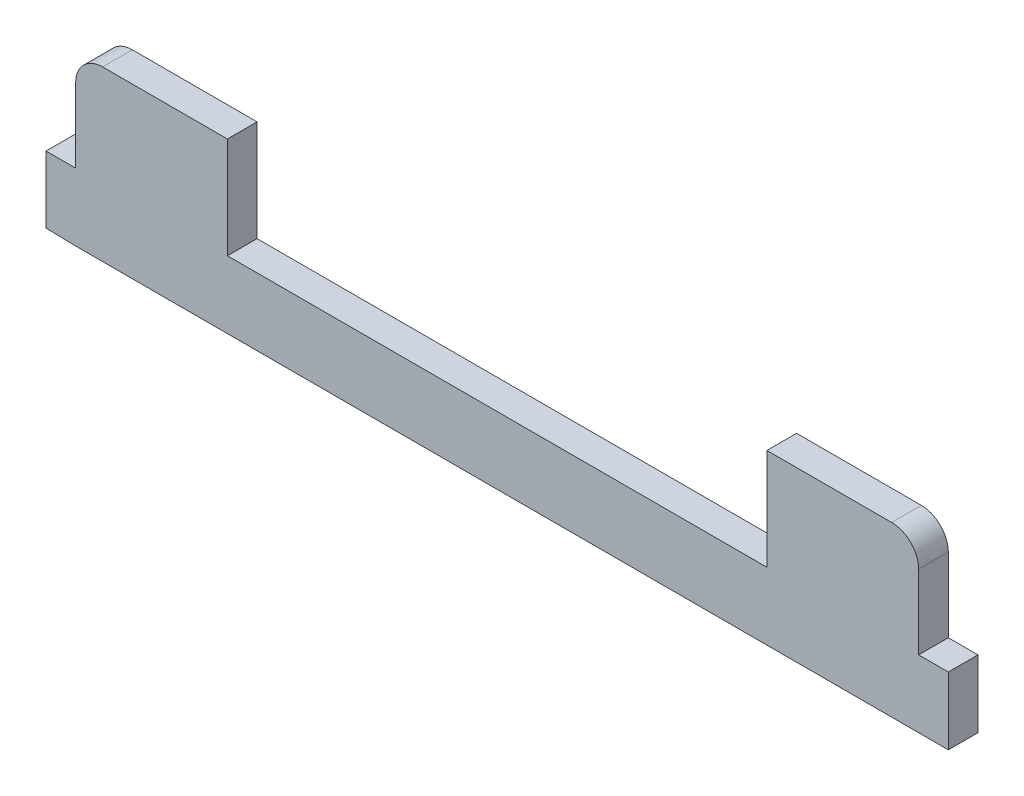
ISO-10303-21;
HEADER;
FILE_DESCRIPTION(('STEP AP214'),'2;1');
FILE_NAME('part.step','',(''),(''),'','','');
FILE_SCHEMA(('AUTOMOTIVE_DESIGN { 1 0 10303 214 1 1 1 1 }'));
ENDSEC;
DATA;
#1=APPLICATION_CONTEXT('core data for automotive mechanical design processes');
#2=APPLICATION_PROTOCOL_DEFINITION('international standard','automotive_design',2000,#1);
#3=PRODUCT_CONTEXT('',#1,'mechanical');
#4=PRODUCT('Part','Part','',(#3));
#5=PRODUCT_RELATED_PRODUCT_CATEGORY('part','',(#4));
#6=PRODUCT_DEFINITION_FORMATION('','',#4);
#7=PRODUCT_DEFINITION_CONTEXT('part definition',#1,'design');
#8=PRODUCT_DEFINITION('design','',#6,#7);
#9=PRODUCT_DEFINITION_SHAPE('','',#8);
#10=(LENGTH_UNIT() NAMED_UNIT(*) SI_UNIT(.MILLI.,.METRE.));
#11=(NAMED_UNIT(*) PLANE_ANGLE_UNIT() SI_UNIT($,.RADIAN.));
#12=(NAMED_UNIT(*) SI_UNIT($,.STERADIAN.) SOLID_ANGLE_UNIT());
#13=UNCERTAINTY_MEASURE_WITH_UNIT(LENGTH_MEASURE(1.E-05),#10,'distance_accuracy_value','');
#14=(GEOMETRIC_REPRESENTATION_CONTEXT(3) GLOBAL_UNCERTAINTY_ASSIGNED_CONTEXT((#13)) GLOBAL_UNIT_ASSIGNED_CONTEXT((#10,
#11,#12)) REPRESENTATION_CONTEXT('',''));
#15=CARTESIAN_POINT('',(0.,0.,0.));
#16=DIRECTION('',(0.,0.,1.));
#17=DIRECTION('',(1.,0.,0.));
#18=AXIS2_PLACEMENT_3D('',#15,#16,#17);
#19=CARTESIAN_POINT('',(-6.99571141739677,0.0621124365959985,2.794));
#20=DIRECTION('',(0.0222251589990039,0.999752990646924,0.));
#21=DIRECTION('',(-0.999752990646924,0.0222251589990039,0.));
#22=AXIS2_PLACEMENT_3D('',#19,#20,#21);
#23=PLANE('',#22);
#24=DIRECTION('',(0.999752990646924,-0.0222251589990039,0.));
#25=VECTOR('',#24,1.);
#26=CARTESIAN_POINT('',(-6.99571141739677,0.0621124365959985,0.));
#27=LINE('',#26,#25);
#28=CARTESIAN_POINT('',(-6.99571141739677,0.0621124365959985,0.));
#29=VERTEX_POINT('',#28);
#30=CARTESIAN_POINT('',(-4.20171141739677,0.,0.));
#31=VERTEX_POINT('',#30);
#32=EDGE_CURVE('E162',#29,#31,#27,.T.);
#33=ORIENTED_EDGE('',*,*,#32,.T.);
#34=DIRECTION('',(0.,0.,-1.));
#35=VECTOR('',#34,1.);
#36=CARTESIAN_POINT('',(-4.20171141739677,0.,2.794));
#37=LINE('',#36,#35);
#38=CARTESIAN_POINT('',(-4.20171141739677,0.,2.794));
#39=VERTEX_POINT('',#38);
#40=EDGE_CURVE('E143',#39,#31,#37,.T.);
#41=ORIENTED_EDGE('',*,*,#40,.F.);
#42=DIRECTION('',(0.999752990646924,-0.0222251589990039,0.));
#43=VECTOR('',#42,1.);
#44=CARTESIAN_POINT('',(-6.99571141739677,0.0621124365959985,2.794));
#45=LINE('',#44,#43);
#46=CARTESIAN_POINT('',(-6.99571141739677,0.0621124365959985,2.794));
#47=VERTEX_POINT('',#46);
#48=EDGE_CURVE('E149',#47,#39,#45,.T.);
#49=ORIENTED_EDGE('',*,*,#48,.F.);
#50=DIRECTION('',(0.,0.,-1.));
#51=VECTOR('',#50,1.);
#52=CARTESIAN_POINT('',(-6.99571141739677,0.0621124365959985,2.794));
#53=LINE('',#52,#51);
#54=EDGE_CURVE('E215',#47,#29,#53,.T.);
#55=ORIENTED_EDGE('',*,*,#54,.T.);
#56=EDGE_LOOP('',(#33,#41,#49,#55));
#57=FACE_BOUND('',#56,.T.);
#58=ADVANCED_FACE('F32',(#57),#23,.F.);
#59=CARTESIAN_POINT('',(77.9672885826032,0.,2.794));
#60=DIRECTION('',(0.,1.,0.));
#61=DIRECTION('',(-1.,0.,0.));
#62=AXIS2_PLACEMENT_3D('',#59,#60,#61);
#63=PLANE('',#62);
#64=DIRECTION('',(1.,0.,0.));
#65=VECTOR('',#64,1.);
#66=CARTESIAN_POINT('',(77.9672885826032,0.,0.));
#67=LINE('',#66,#65);
#68=CARTESIAN_POINT('',(77.9672885826032,0.,0.));
#69=VERTEX_POINT('',#68);
#70=EDGE_CURVE('E247',#31,#69,#67,.T.);
#71=ORIENTED_EDGE('',*,*,#70,.T.);
#72=DIRECTION('',(0.,0.,-1.));
#73=VECTOR('',#72,1.);
#74=CARTESIAN_POINT('',(77.9672885826032,0.,2.794));
#75=LINE('',#74,#73);
#76=CARTESIAN_POINT('',(77.9672885826032,0.,2.794));
#77=VERTEX_POINT('',#76);
#78=EDGE_CURVE('E146',#77,#69,#75,.T.);
#79=ORIENTED_EDGE('',*,*,#78,.F.);
#80=DIRECTION('',(1.,0.,0.));
#81=VECTOR('',#80,1.);
#82=CARTESIAN_POINT('',(-4.20171141739677,0.,2.794));
#83=LINE('',#82,#81);
#84=EDGE_CURVE('E139',#39,#77,#83,.T.);
#85=ORIENTED_EDGE('',*,*,#84,.F.);
#86=ORIENTED_EDGE('',*,*,#40,.T.);
#87=EDGE_LOOP('',(#71,#79,#85,#86));
#88=FACE_BOUND('',#87,.T.);
#89=ADVANCED_FACE('F141',(#88),#63,.F.);
#90=CARTESIAN_POINT('',(77.9672885826032,6.35,2.794));
#91=DIRECTION('',(-1.,0.,0.));
#92=DIRECTION('',(0.,0.,1.));
#93=AXIS2_PLACEMENT_3D('',#90,#91,#92);
#94=PLANE('',#93);
#95=DIRECTION('',(0.,1.,0.));
#96=VECTOR('',#95,1.);
#97=CARTESIAN_POINT('',(77.9672885826032,6.35,0.));
#98=LINE('',#97,#96);
#99=CARTESIAN_POINT('',(77.9672885826032,6.35,0.));
#100=VERTEX_POINT('',#99);
#101=EDGE_CURVE('E246',#69,#100,#98,.T.);
#102=ORIENTED_EDGE('',*,*,#101,.T.);
#103=DIRECTION('',(0.,0.,-1.));
#104=VECTOR('',#103,1.);
#105=CARTESIAN_POINT('',(77.9672885826032,6.35,2.794));
#106=LINE('',#105,#104);
#107=CARTESIAN_POINT('',(77.9672885826032,6.35,2.794));
#108=VERTEX_POINT('',#107);
#109=EDGE_CURVE('E168',#108,#100,#106,.T.);
#110=ORIENTED_EDGE('',*,*,#109,.F.);
#111=DIRECTION('',(0.,1.,0.));
#112=VECTOR('',#111,1.);
#113=CARTESIAN_POINT('',(77.9672885826032,6.35,2.794));
#114=LINE('',#113,#112);
#115=EDGE_CURVE('E148',#77,#108,#114,.T.);
#116=ORIENTED_EDGE('',*,*,#115,.F.);
#117=ORIENTED_EDGE('',*,*,#78,.T.);
#118=EDGE_LOOP('',(#102,#110,#116,#117));
#119=FACE_BOUND('',#118,.T.);
#120=ADVANCED_FACE('F269',(#119),#94,.F.);
#121=CARTESIAN_POINT('',(75.1732885826032,6.35,2.794));
#122=DIRECTION('',(0.,-1.,0.));
#123=DIRECTION('',(0.,0.,-1.));
#124=AXIS2_PLACEMENT_3D('',#121,#122,#123);
#125=PLANE('',#124);
#126=DIRECTION('',(-1.,0.,0.));
#127=VECTOR('',#126,1.);
#128=CARTESIAN_POINT('',(75.1732885826032,6.35,0.));
#129=LINE('',#128,#127);
#130=CARTESIAN_POINT('',(75.1732885826032,6.35,0.));
#131=VERTEX_POINT('',#130);
#132=EDGE_CURVE('E200',#100,#131,#129,.T.);
#133=ORIENTED_EDGE('',*,*,#132,.T.);
#134=DIRECTION('',(0.,0.,-1.));
#135=VECTOR('',#134,1.);
#136=CARTESIAN_POINT('',(75.1732885826032,6.35,2.794));
#137=LINE('',#136,#135);
#138=CARTESIAN_POINT('',(75.1732885826032,6.35,2.794));
#139=VERTEX_POINT('',#138);
#140=EDGE_CURVE('E234',#139,#131,#137,.T.);
#141=ORIENTED_EDGE('',*,*,#140,.F.);
#142=DIRECTION('',(-1.,0.,0.));
#143=VECTOR('',#142,1.);
#144=CARTESIAN_POINT('',(75.1732885826032,6.35,2.794));
#145=LINE('',#144,#143);
#146=EDGE_CURVE('E243',#108,#139,#145,.T.);
#147=ORIENTED_EDGE('',*,*,#146,.F.);
#148=ORIENTED_EDGE('',*,*,#109,.T.);
#149=EDGE_LOOP('',(#133,#141,#147,#148));
#150=FACE_BOUND('',#149,.T.);
#151=ADVANCED_FACE('F241',(#150),#125,.F.);
#152=CARTESIAN_POINT('',(75.1732885826032,6.35,2.794));
#153=DIRECTION('',(-1.,0.,0.));
#154=DIRECTION('',(0.,0.,1.));
#155=AXIS2_PLACEMENT_3D('',#152,#153,#154);
#156=PLANE('',#155);
#157=DIRECTION('',(0.,1.,0.));
#158=VECTOR('',#157,1.);
#159=CARTESIAN_POINT('',(75.1732885826032,6.35,0.));
#160=LINE('',#159,#158);
#161=CARTESIAN_POINT('',(75.1732885826032,13.335,0.));
#162=VERTEX_POINT('',#161);
#163=EDGE_CURVE('E196',#131,#162,#160,.T.);
#164=ORIENTED_EDGE('',*,*,#163,.T.);
#165=DIRECTION('',(0.,0.,-1.));
#166=VECTOR('',#165,1.);
#167=CARTESIAN_POINT('',(75.1732885826032,13.335,2.794));
#168=LINE('',#167,#166);
#169=CARTESIAN_POINT('',(75.1732885826032,13.335,2.794));
#170=VERTEX_POINT('',#169);
#171=EDGE_CURVE('E11',#162,#170,#168,.F.);
#172=ORIENTED_EDGE('',*,*,#171,.T.);
#173=DIRECTION('',(0.,1.,0.));
#174=VECTOR('',#173,1.);
#175=CARTESIAN_POINT('',(75.1732885826032,6.35,2.794));
#176=LINE('',#175,#174);
#177=EDGE_CURVE('E266',#139,#170,#176,.T.);
#178=ORIENTED_EDGE('',*,*,#177,.F.);
#179=ORIENTED_EDGE('',*,*,#140,.T.);
#180=EDGE_LOOP('',(#164,#172,#178,#179));
#181=FACE_BOUND('',#180,.T.);
#182=ADVANCED_FACE('F276',(#181),#156,.F.);
#183=CARTESIAN_POINT('',(75.1732885826032,15.875,2.794));
#184=DIRECTION('',(0.,-1.,0.));
#185=DIRECTION('',(0.,0.,-1.));
#186=AXIS2_PLACEMENT_3D('',#183,#184,#185);
#187=PLANE('',#186);
#188=DIRECTION('',(-1.,0.,0.));
#189=VECTOR('',#188,1.);
#190=CARTESIAN_POINT('',(75.1732885826032,15.875,2.794));
#191=LINE('',#190,#189);
#192=CARTESIAN_POINT('',(72.6332885826032,15.875,2.794));
#193=VERTEX_POINT('',#192);
#194=CARTESIAN_POINT('',(60.8857885826032,15.875,2.794));
#195=VERTEX_POINT('',#194);
#196=EDGE_CURVE('E187',#193,#195,#191,.T.);
#197=ORIENTED_EDGE('',*,*,#196,.F.);
#198=DIRECTION('',(0.,0.,-1.));
#199=VECTOR('',#198,1.);
#200=CARTESIAN_POINT('',(72.6332885826032,15.875,2.794));
#201=LINE('',#200,#199);
#202=CARTESIAN_POINT('',(72.6332885826032,15.875,0.));
#203=VERTEX_POINT('',#202);
#204=EDGE_CURVE('E40',#193,#203,#201,.T.);
#205=ORIENTED_EDGE('',*,*,#204,.T.);
#206=DIRECTION('',(-1.,0.,0.));
#207=VECTOR('',#206,1.);
#208=CARTESIAN_POINT('',(75.1732885826032,15.875,0.));
#209=LINE('',#208,#207);
#210=CARTESIAN_POINT('',(60.8857885826032,15.875,0.));
#211=VERTEX_POINT('',#210);
#212=EDGE_CURVE('E185',#203,#211,#209,.T.);
#213=ORIENTED_EDGE('',*,*,#212,.T.);
#214=DIRECTION('',(0.,0.,-1.));
#215=VECTOR('',#214,1.);
#216=CARTESIAN_POINT('',(60.8857885826032,15.875,2.794));
#217=LINE('',#216,#215);
#218=EDGE_CURVE('E232',#195,#211,#217,.T.);
#219=ORIENTED_EDGE('',*,*,#218,.F.);
#220=EDGE_LOOP('',(#197,#205,#213,#219));
#221=FACE_BOUND('',#220,.T.);
#222=ADVANCED_FACE('F183',(#221),#187,.F.);
#223=CARTESIAN_POINT('',(60.8857885826032,15.875,2.794));
#224=DIRECTION('',(1.,0.,0.));
#225=DIRECTION('',(0.,0.,-1.));
#226=AXIS2_PLACEMENT_3D('',#223,#224,#225);
#227=PLANE('',#226);
#228=DIRECTION('',(0.,-1.,0.));
#229=VECTOR('',#228,1.);
#230=CARTESIAN_POINT('',(60.8857885826032,15.875,0.));
#231=LINE('',#230,#229);
#232=CARTESIAN_POINT('',(60.8857885826032,6.35,0.));
#233=VERTEX_POINT('',#232);
#234=EDGE_CURVE('E195',#211,#233,#231,.T.);
#235=ORIENTED_EDGE('',*,*,#234,.T.);
#236=DIRECTION('',(0.,0.,-1.));
#237=VECTOR('',#236,1.);
#238=CARTESIAN_POINT('',(60.8857885826032,6.35,2.794));
#239=LINE('',#238,#237);
#240=CARTESIAN_POINT('',(60.8857885826032,6.35,2.794));
#241=VERTEX_POINT('',#240);
#242=EDGE_CURVE('E229',#241,#233,#239,.T.);
#243=ORIENTED_EDGE('',*,*,#242,.F.);
#244=DIRECTION('',(0.,-1.,0.));
#245=VECTOR('',#244,1.);
#246=CARTESIAN_POINT('',(60.8857885826032,15.875,2.794));
#247=LINE('',#246,#245);
#248=EDGE_CURVE('E263',#195,#241,#247,.T.);
#249=ORIENTED_EDGE('',*,*,#248,.F.);
#250=ORIENTED_EDGE('',*,*,#218,.T.);
#251=EDGE_LOOP('',(#235,#243,#249,#250));
#252=FACE_BOUND('',#251,.T.);
#253=ADVANCED_FACE('F322',(#252),#227,.F.);
#254=CARTESIAN_POINT('',(60.8857885826032,6.35,2.794));
#255=DIRECTION('',(0.,-1.,0.));
#256=DIRECTION('',(1.,0.,0.));
#257=AXIS2_PLACEMENT_3D('',#254,#255,#256);
#258=PLANE('',#257);
#259=DIRECTION('',(-1.,0.,0.));
#260=VECTOR('',#259,1.);
#261=CARTESIAN_POINT('',(60.8857885826032,6.35,0.));
#262=LINE('',#261,#260);
#263=CARTESIAN_POINT('',(10.0857885826032,6.34999999999999,0.));
#264=VERTEX_POINT('',#263);
#265=EDGE_CURVE('E198',#233,#264,#262,.T.);
#266=ORIENTED_EDGE('',*,*,#265,.T.);
#267=DIRECTION('',(0.,0.,-1.));
#268=VECTOR('',#267,1.);
#269=CARTESIAN_POINT('',(10.0857885826032,6.34999999999999,2.794));
#270=LINE('',#269,#268);
#271=CARTESIAN_POINT('',(10.0857885826032,6.34999999999999,2.794));
#272=VERTEX_POINT('',#271);
#273=EDGE_CURVE('E226',#272,#264,#270,.T.);
#274=ORIENTED_EDGE('',*,*,#273,.F.);
#275=DIRECTION('',(-1.,0.,0.));
#276=VECTOR('',#275,1.);
#277=CARTESIAN_POINT('',(60.8857885826032,6.35,2.794));
#278=LINE('',#277,#276);
#279=EDGE_CURVE('E261',#241,#272,#278,.T.);
#280=ORIENTED_EDGE('',*,*,#279,.F.);
#281=ORIENTED_EDGE('',*,*,#242,.T.);
#282=EDGE_LOOP('',(#266,#274,#280,#281));
#283=FACE_BOUND('',#282,.T.);
#284=ADVANCED_FACE('F317',(#283),#258,.F.);
#285=CARTESIAN_POINT('',(10.0857885826032,6.34999999999999,2.794));
#286=DIRECTION('',(-1.,0.,0.));
#287=DIRECTION('',(0.,-1.,0.));
#288=AXIS2_PLACEMENT_3D('',#285,#286,#287);
#289=PLANE('',#288);
#290=DIRECTION('',(0.,1.,0.));
#291=VECTOR('',#290,1.);
#292=CARTESIAN_POINT('',(10.0857885826032,6.34999999999999,0.));
#293=LINE('',#292,#291);
#294=CARTESIAN_POINT('',(10.0857885826032,15.875,0.));
#295=VERTEX_POINT('',#294);
#296=EDGE_CURVE('E205',#264,#295,#293,.T.);
#297=ORIENTED_EDGE('',*,*,#296,.T.);
#298=DIRECTION('',(0.,0.,-1.));
#299=VECTOR('',#298,1.);
#300=CARTESIAN_POINT('',(10.0857885826032,15.875,2.794));
#301=LINE('',#300,#299);
#302=CARTESIAN_POINT('',(10.0857885826032,15.875,2.794));
#303=VERTEX_POINT('',#302);
#304=EDGE_CURVE('E223',#303,#295,#301,.T.);
#305=ORIENTED_EDGE('',*,*,#304,.F.);
#306=DIRECTION('',(0.,1.,0.));
#307=VECTOR('',#306,1.);
#308=CARTESIAN_POINT('',(10.0857885826032,6.34999999999999,2.794));
#309=LINE('',#308,#307);
#310=EDGE_CURVE('E259',#272,#303,#309,.T.);
#311=ORIENTED_EDGE('',*,*,#310,.F.);
#312=ORIENTED_EDGE('',*,*,#273,.T.);
#313=EDGE_LOOP('',(#297,#305,#311,#312));
#314=FACE_BOUND('',#313,.T.);
#315=ADVANCED_FACE('F314',(#314),#289,.F.);
#316=CARTESIAN_POINT('',(10.0857885826032,15.875,2.794));
#317=DIRECTION('',(0.,-1.,0.));
#318=DIRECTION('',(1.,0.,0.));
#319=AXIS2_PLACEMENT_3D('',#316,#317,#318);
#320=PLANE('',#319);
#321=DIRECTION('',(-1.,0.,0.));
#322=VECTOR('',#321,1.);
#323=CARTESIAN_POINT('',(10.0857885826032,15.875,0.));
#324=LINE('',#323,#322);
#325=CARTESIAN_POINT('',(-1.66171141739677,15.875,0.));
#326=VERTEX_POINT('',#325);
#327=EDGE_CURVE('E207',#295,#326,#324,.T.);
#328=ORIENTED_EDGE('',*,*,#327,.T.);
#329=DIRECTION('',(0.,0.,-1.));
#330=VECTOR('',#329,1.);
#331=CARTESIAN_POINT('',(-1.66171141739677,15.875,2.794));
#332=LINE('',#331,#330);
#333=CARTESIAN_POINT('',(-1.66171141739677,15.875,2.794));
#334=VERTEX_POINT('',#333);
#335=EDGE_CURVE('E175',#326,#334,#332,.F.);
#336=ORIENTED_EDGE('',*,*,#335,.T.);
#337=DIRECTION('',(-1.,0.,0.));
#338=VECTOR('',#337,1.);
#339=CARTESIAN_POINT('',(10.0857885826032,15.875,2.794));
#340=LINE('',#339,#338);
#341=EDGE_CURVE('E257',#303,#334,#340,.T.);
#342=ORIENTED_EDGE('',*,*,#341,.F.);
#343=ORIENTED_EDGE('',*,*,#304,.T.);
#344=EDGE_LOOP('',(#328,#336,#342,#343));
#345=FACE_BOUND('',#344,.T.);
#346=ADVANCED_FACE('F310',(#345),#320,.F.);
#347=CARTESIAN_POINT('',(-4.20171141739677,15.875,2.794));
#348=DIRECTION('',(1.,0.,0.));
#349=DIRECTION('',(0.,1.,0.));
#350=AXIS2_PLACEMENT_3D('',#347,#348,#349);
#351=PLANE('',#350);
#352=DIRECTION('',(0.,-1.,0.));
#353=VECTOR('',#352,1.);
#354=CARTESIAN_POINT('',(-4.20171141739677,15.875,2.794));
#355=LINE('',#354,#353);
#356=CARTESIAN_POINT('',(-4.20171141739677,13.335,2.794));
#357=VERTEX_POINT('',#356);
#358=CARTESIAN_POINT('',(-4.20171141739677,6.35,2.794));
#359=VERTEX_POINT('',#358);
#360=EDGE_CURVE('E255',#357,#359,#355,.T.);
#361=ORIENTED_EDGE('',*,*,#360,.F.);
#362=DIRECTION('',(0.,0.,-1.));
#363=VECTOR('',#362,1.);
#364=CARTESIAN_POINT('',(-4.20171141739677,13.335,2.794));
#365=LINE('',#364,#363);
#366=CARTESIAN_POINT('',(-4.20171141739677,13.335,0.));
#367=VERTEX_POINT('',#366);
#368=EDGE_CURVE('E163',#357,#367,#365,.T.);
#369=ORIENTED_EDGE('',*,*,#368,.T.);
#370=DIRECTION('',(0.,-1.,0.));
#371=VECTOR('',#370,1.);
#372=CARTESIAN_POINT('',(-4.20171141739677,15.875,0.));
#373=LINE('',#372,#371);
#374=CARTESIAN_POINT('',(-4.20171141739677,6.35,0.));
#375=VERTEX_POINT('',#374);
#376=EDGE_CURVE('E210',#367,#375,#373,.T.);
#377=ORIENTED_EDGE('',*,*,#376,.T.);
#378=DIRECTION('',(0.,0.,-1.));
#379=VECTOR('',#378,1.);
#380=CARTESIAN_POINT('',(-4.20171141739677,6.35,2.794));
#381=LINE('',#380,#379);
#382=EDGE_CURVE('E220',#359,#375,#381,.T.);
#383=ORIENTED_EDGE('',*,*,#382,.F.);
#384=EDGE_LOOP('',(#361,#369,#377,#383));
#385=FACE_BOUND('',#384,.T.);
#386=ADVANCED_FACE('F298',(#385),#351,.F.);
#387=CARTESIAN_POINT('',(-4.20171141739677,6.35,2.794));
#388=DIRECTION('',(0.,-1.,0.));
#389=DIRECTION('',(1.,0.,0.));
#390=AXIS2_PLACEMENT_3D('',#387,#388,#389);
#391=PLANE('',#390);
#392=DIRECTION('',(-1.,0.,0.));
#393=VECTOR('',#392,1.);
#394=CARTESIAN_POINT('',(-4.20171141739677,6.35,0.));
#395=LINE('',#394,#393);
#396=CARTESIAN_POINT('',(-6.99571141739677,6.34999999999999,0.));
#397=VERTEX_POINT('',#396);
#398=EDGE_CURVE('E212',#375,#397,#395,.T.);
#399=ORIENTED_EDGE('',*,*,#398,.T.);
#400=DIRECTION('',(0.,0.,-1.));
#401=VECTOR('',#400,1.);
#402=CARTESIAN_POINT('',(-6.99571141739677,6.34999999999999,2.794));
#403=LINE('',#402,#401);
#404=CARTESIAN_POINT('',(-6.99571141739677,6.34999999999999,2.794));
#405=VERTEX_POINT('',#404);
#406=EDGE_CURVE('E217',#405,#397,#403,.T.);
#407=ORIENTED_EDGE('',*,*,#406,.F.);
#408=DIRECTION('',(-1.,0.,0.));
#409=VECTOR('',#408,1.);
#410=CARTESIAN_POINT('',(-4.20171141739677,6.35,2.794));
#411=LINE('',#410,#409);
#412=EDGE_CURVE('E253',#359,#405,#411,.T.);
#413=ORIENTED_EDGE('',*,*,#412,.F.);
#414=ORIENTED_EDGE('',*,*,#382,.T.);
#415=EDGE_LOOP('',(#399,#407,#413,#414));
#416=FACE_BOUND('',#415,.T.);
#417=ADVANCED_FACE('F303',(#416),#391,.F.);
#418=CARTESIAN_POINT('',(-6.99571141739677,6.34999999999999,2.794));
#419=DIRECTION('',(1.,0.,0.));
#420=DIRECTION('',(0.,0.,-1.));
#421=AXIS2_PLACEMENT_3D('',#418,#419,#420);
#422=PLANE('',#421);
#423=DIRECTION('',(0.,-1.,0.));
#424=VECTOR('',#423,1.);
#425=CARTESIAN_POINT('',(-6.99571141739677,6.34999999999999,0.));
#426=LINE('',#425,#424);
#427=EDGE_CURVE('E159',#397,#29,#426,.T.);
#428=ORIENTED_EDGE('',*,*,#427,.T.);
#429=ORIENTED_EDGE('',*,*,#54,.F.);
#430=DIRECTION('',(0.,-1.,0.));
#431=VECTOR('',#430,1.);
#432=CARTESIAN_POINT('',(-6.99571141739677,6.34999999999999,2.794));
#433=LINE('',#432,#431);
#434=EDGE_CURVE('E155',#405,#47,#433,.T.);
#435=ORIENTED_EDGE('',*,*,#434,.F.);
#436=ORIENTED_EDGE('',*,*,#406,.T.);
#437=EDGE_LOOP('',(#428,#429,#435,#436));
#438=FACE_BOUND('',#437,.T.);
#439=ADVANCED_FACE('F306',(#438),#422,.F.);
#440=CARTESIAN_POINT('',(0.,0.,2.794));
#441=DIRECTION('',(0.,0.,-1.));
#442=DIRECTION('',(-1.,0.,0.));
#443=AXIS2_PLACEMENT_3D('',#440,#441,#442);
#444=PLANE('',#443);
#445=ORIENTED_EDGE('',*,*,#341,.T.);
#446=CARTESIAN_POINT('',(-1.66171141739677,13.335,2.794));
#447=DIRECTION('',(0.,0.,-1.));
#448=DIRECTION('',(-1.,0.,0.));
#449=AXIS2_PLACEMENT_3D('',#446,#447,#448);
#450=CIRCLE('',#449,2.54);
#451=EDGE_CURVE('E178',#334,#357,#450,.F.);
#452=ORIENTED_EDGE('',*,*,#451,.T.);
#453=ORIENTED_EDGE('',*,*,#360,.T.);
#454=ORIENTED_EDGE('',*,*,#412,.T.);
#455=ORIENTED_EDGE('',*,*,#434,.T.);
#456=ORIENTED_EDGE('',*,*,#48,.T.);
#457=ORIENTED_EDGE('',*,*,#84,.T.);
#458=ORIENTED_EDGE('',*,*,#115,.T.);
#459=ORIENTED_EDGE('',*,*,#146,.T.);
#460=ORIENTED_EDGE('',*,*,#177,.T.);
#461=CARTESIAN_POINT('',(72.6332885826032,13.335,2.794));
#462=DIRECTION('',(0.,0.,-1.));
#463=DIRECTION('',(-1.,0.,0.));
#464=AXIS2_PLACEMENT_3D('',#461,#462,#463);
#465=CIRCLE('',#464,2.54);
#466=EDGE_CURVE('E47',#170,#193,#465,.F.);
#467=ORIENTED_EDGE('',*,*,#466,.T.);
#468=ORIENTED_EDGE('',*,*,#196,.T.);
#469=ORIENTED_EDGE('',*,*,#248,.T.);
#470=ORIENTED_EDGE('',*,*,#279,.T.);
#471=ORIENTED_EDGE('',*,*,#310,.T.);
#472=EDGE_LOOP('',(#445,#452,#453,#454,#455,#456,#457,#458,#459,#460,#467,#468,#469,#470,#471));
#473=FACE_BOUND('',#472,.T.);
#474=ADVANCED_FACE('F153',(#473),#444,.F.);
#475=CARTESIAN_POINT('',(0.,0.,0.));
#476=DIRECTION('',(0.,0.,-1.));
#477=DIRECTION('',(-1.,0.,0.));
#478=AXIS2_PLACEMENT_3D('',#475,#476,#477);
#479=PLANE('',#478);
#480=ORIENTED_EDGE('',*,*,#376,.F.);
#481=CARTESIAN_POINT('',(-1.66171141739677,13.335,0.));
#482=DIRECTION('',(0.,0.,-1.));
#483=DIRECTION('',(-1.,0.,0.));
#484=AXIS2_PLACEMENT_3D('',#481,#482,#483);
#485=CIRCLE('',#484,2.54);
#486=EDGE_CURVE('E173',#367,#326,#485,.T.);
#487=ORIENTED_EDGE('',*,*,#486,.T.);
#488=ORIENTED_EDGE('',*,*,#327,.F.);
#489=ORIENTED_EDGE('',*,*,#296,.F.);
#490=ORIENTED_EDGE('',*,*,#265,.F.);
#491=ORIENTED_EDGE('',*,*,#234,.F.);
#492=ORIENTED_EDGE('',*,*,#212,.F.);
#493=CARTESIAN_POINT('',(72.6332885826032,13.335,0.));
#494=DIRECTION('',(0.,0.,-1.));
#495=DIRECTION('',(-1.,0.,0.));
#496=AXIS2_PLACEMENT_3D('',#493,#494,#495);
#497=CIRCLE('',#496,2.54);
#498=EDGE_CURVE('E166',#203,#162,#497,.T.);
#499=ORIENTED_EDGE('',*,*,#498,.T.);
#500=ORIENTED_EDGE('',*,*,#163,.F.);
#501=ORIENTED_EDGE('',*,*,#132,.F.);
#502=ORIENTED_EDGE('',*,*,#101,.F.);
#503=ORIENTED_EDGE('',*,*,#70,.F.);
#504=ORIENTED_EDGE('',*,*,#32,.F.);
#505=ORIENTED_EDGE('',*,*,#427,.F.);
#506=ORIENTED_EDGE('',*,*,#398,.F.);
#507=EDGE_LOOP('',(#480,#487,#488,#489,#490,#491,#492,#499,#500,#501,#502,#503,#504,#505,#506));
#508=FACE_BOUND('',#507,.T.);
#509=ADVANCED_FACE('F192',(#508),#479,.T.);
#510=CARTESIAN_POINT('',(-1.66171141739677,13.335,2.794));
#511=DIRECTION('',(0.,0.,-1.));
#512=DIRECTION('',(-1.,0.,0.));
#513=AXIS2_PLACEMENT_3D('',#510,#511,#512);
#514=CYLINDRICAL_SURFACE('',#513,2.54);
#515=ORIENTED_EDGE('',*,*,#451,.F.);
#516=ORIENTED_EDGE('',*,*,#335,.F.);
#517=ORIENTED_EDGE('',*,*,#486,.F.);
#518=ORIENTED_EDGE('',*,*,#368,.F.);
#519=EDGE_LOOP('',(#515,#516,#517,#518));
#520=FACE_BOUND('',#519,.T.);
#521=ADVANCED_FACE('F283',(#520),#514,.T.);
#522=CARTESIAN_POINT('',(72.6332885826032,13.335,2.794));
#523=DIRECTION('',(0.,0.,-1.));
#524=DIRECTION('',(-1.,0.,0.));
#525=AXIS2_PLACEMENT_3D('',#522,#523,#524);
#526=CYLINDRICAL_SURFACE('',#525,2.54);
#527=ORIENTED_EDGE('',*,*,#466,.F.);
#528=ORIENTED_EDGE('',*,*,#171,.F.);
#529=ORIENTED_EDGE('',*,*,#498,.F.);
#530=ORIENTED_EDGE('',*,*,#204,.F.);
#531=EDGE_LOOP('',(#527,#528,#529,#530));
#532=FACE_BOUND('',#531,.T.);
#533=ADVANCED_FACE('F34',(#532),#526,.T.);
#534=CLOSED_SHELL('',(#58,#89,#120,#151,#182,#222,#253,#284,#315,#346,#386,#417,#439,#474,#509,
#521,#533));
#535=MANIFOLD_SOLID_BREP('B2',#534);
#536=ADVANCED_BREP_SHAPE_REPRESENTATION('',(#18,#535),#14);
#537=SHAPE_DEFINITION_REPRESENTATION(#9,#536);
ENDSEC;
END-ISO-10303-21;
